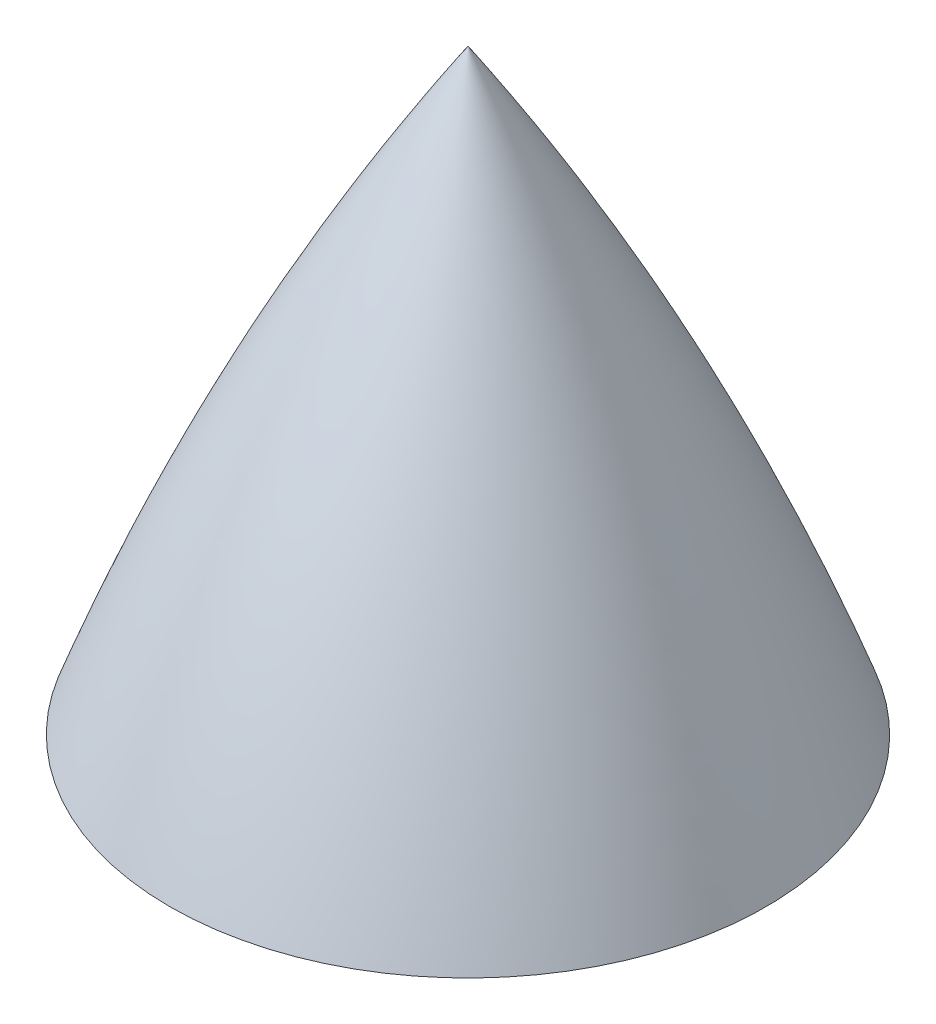
ISO-10303-21;
HEADER;
FILE_DESCRIPTION(('STEP AP214'),'2;1');
FILE_NAME('part.step','',(''),(''),'','','');
FILE_SCHEMA(('AUTOMOTIVE_DESIGN { 1 0 10303 214 1 1 1 1 }'));
ENDSEC;
DATA;
#1=APPLICATION_CONTEXT('core data for automotive mechanical design processes');
#2=APPLICATION_PROTOCOL_DEFINITION('international standard','automotive_design',2000,#1);
#3=PRODUCT_CONTEXT('',#1,'mechanical');
#4=PRODUCT('Part','Part','',(#3));
#5=PRODUCT_RELATED_PRODUCT_CATEGORY('part','',(#4));
#6=PRODUCT_DEFINITION_FORMATION('','',#4);
#7=PRODUCT_DEFINITION_CONTEXT('part definition',#1,'design');
#8=PRODUCT_DEFINITION('design','',#6,#7);
#9=PRODUCT_DEFINITION_SHAPE('','',#8);
#10=(LENGTH_UNIT() NAMED_UNIT(*) SI_UNIT(.MILLI.,.METRE.));
#11=(NAMED_UNIT(*) PLANE_ANGLE_UNIT() SI_UNIT($,.RADIAN.));
#12=(NAMED_UNIT(*) SI_UNIT($,.STERADIAN.) SOLID_ANGLE_UNIT());
#13=UNCERTAINTY_MEASURE_WITH_UNIT(LENGTH_MEASURE(1.E-05),#10,'distance_accuracy_value','');
#14=(GEOMETRIC_REPRESENTATION_CONTEXT(3) GLOBAL_UNCERTAINTY_ASSIGNED_CONTEXT((#13)) GLOBAL_UNIT_ASSIGNED_CONTEXT((#10,
#11,#12)) REPRESENTATION_CONTEXT('',''));
#15=CARTESIAN_POINT('',(0.,0.,0.));
#16=DIRECTION('',(0.,0.,1.));
#17=DIRECTION('',(1.,0.,0.));
#18=AXIS2_PLACEMENT_3D('',#15,#16,#17);
#19=CARTESIAN_POINT('',(0.,0.4,0.2));
#20=CARTESIAN_POINT('',(0.,0.210448914824026,0.0759079707793594));
#21=CARTESIAN_POINT('',(0.,0.,0.));
#22=B_SPLINE_CURVE_WITH_KNOTS('',2,(#19,#20,#21),.UNSPECIFIED.,.F.,.F.,(3,3),(0.,1.),.UNSPECIFIED.);
#23=CARTESIAN_POINT('',(0.,0.4,0.2));
#24=DIRECTION('',(0.,1.,0.));
#25=AXIS1_PLACEMENT('',#23,#24);
#26=SURFACE_OF_REVOLUTION('',#22,#25);
#27=CARTESIAN_POINT('',(0.,0.,0.2));
#28=DIRECTION('',(0.,1.,0.));
#29=DIRECTION('',(0.,0.,1.));
#30=AXIS2_PLACEMENT_3D('',#27,#28,#29);
#31=CIRCLE('',#30,0.2);
#32=CARTESIAN_POINT('',(0.,0.,0.4));
#33=VERTEX_POINT('',#32);
#34=EDGE_CURVE('E11',#33,#33,#31,.T.);
#35=ORIENTED_EDGE('',*,*,#34,.T.);
#36=EDGE_LOOP('',(#35));
#37=FACE_BOUND('',#36,.T.);
#38=CARTESIAN_POINT('',(0.,0.4,0.2));
#39=VERTEX_POINT('',#38);
#40=VERTEX_LOOP('',#39);
#41=FACE_BOUND('',#40,.T.);
#42=ADVANCED_FACE('F36',(#37,#41),#26,.F.);
#43=CARTESIAN_POINT('',(0.,0.,0.));
#44=DIRECTION('',(0.,1.,0.));
#45=DIRECTION('',(0.,0.,1.));
#46=AXIS2_PLACEMENT_3D('',#43,#44,#45);
#47=PLANE('',#46);
#48=ORIENTED_EDGE('',*,*,#34,.F.);
#49=EDGE_LOOP('',(#48));
#50=FACE_BOUND('',#49,.T.);
#51=ADVANCED_FACE('F45',(#50),#47,.F.);
#52=CLOSED_SHELL('',(#42,#51));
#53=MANIFOLD_SOLID_BREP('B2',#52);
#54=ADVANCED_BREP_SHAPE_REPRESENTATION('',(#18,#53),#14);
#55=SHAPE_DEFINITION_REPRESENTATION(#9,#54);
ENDSEC;
END-ISO-10303-21;
